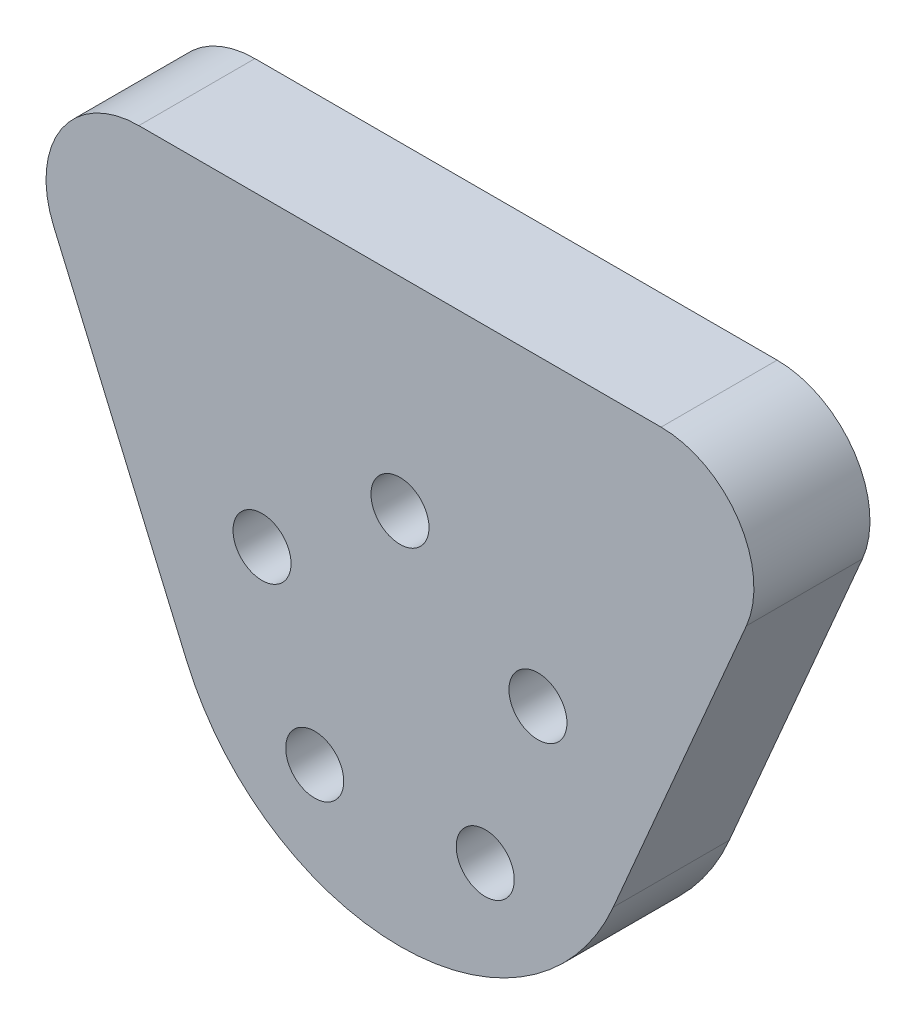
ISO-10303-21;
HEADER;
FILE_DESCRIPTION(('STEP AP214'),'2;1');
FILE_NAME('part.step','',(''),(''),'','','');
FILE_SCHEMA(('AUTOMOTIVE_DESIGN { 1 0 10303 214 1 1 1 1 }'));
ENDSEC;
DATA;
#1=APPLICATION_CONTEXT('core data for automotive mechanical design processes');
#2=APPLICATION_PROTOCOL_DEFINITION('international standard','automotive_design',2000,#1);
#3=PRODUCT_CONTEXT('',#1,'mechanical');
#4=PRODUCT('Part','Part','',(#3));
#5=PRODUCT_RELATED_PRODUCT_CATEGORY('part','',(#4));
#6=PRODUCT_DEFINITION_FORMATION('','',#4);
#7=PRODUCT_DEFINITION_CONTEXT('part definition',#1,'design');
#8=PRODUCT_DEFINITION('design','',#6,#7);
#9=PRODUCT_DEFINITION_SHAPE('','',#8);
#10=(LENGTH_UNIT() NAMED_UNIT(*) SI_UNIT(.MILLI.,.METRE.));
#11=(NAMED_UNIT(*) PLANE_ANGLE_UNIT() SI_UNIT($,.RADIAN.));
#12=(NAMED_UNIT(*) SI_UNIT($,.STERADIAN.) SOLID_ANGLE_UNIT());
#13=UNCERTAINTY_MEASURE_WITH_UNIT(LENGTH_MEASURE(1.E-05),#10,'distance_accuracy_value','');
#14=(GEOMETRIC_REPRESENTATION_CONTEXT(3) GLOBAL_UNCERTAINTY_ASSIGNED_CONTEXT((#13)) GLOBAL_UNIT_ASSIGNED_CONTEXT((#10,
#11,#12)) REPRESENTATION_CONTEXT('',''));
#15=CARTESIAN_POINT('',(0.,0.,0.));
#16=DIRECTION('',(0.,0.,1.));
#17=DIRECTION('',(1.,0.,0.));
#18=AXIS2_PLACEMENT_3D('',#15,#16,#17);
#19=CARTESIAN_POINT('',(-45.,0.,10.));
#20=DIRECTION('',(0.,0.,1.));
#21=DIRECTION('',(1.,0.,0.));
#22=AXIS2_PLACEMENT_3D('',#19,#20,#21);
#23=PLANE('',#22);
#24=CARTESIAN_POINT('',(-29.8473156536559,-32.1127124296868,10.));
#25=DIRECTION('',(0.,0.,1.));
#26=DIRECTION('',(1.,0.,0.));
#27=AXIS2_PLACEMENT_3D('',#24,#25,#26);
#28=CIRCLE('',#27,2.49999999999999);
#29=CARTESIAN_POINT('',(-27.3473156536559,-32.1127124296868,10.));
#30=VERTEX_POINT('',#29);
#31=EDGE_CURVE('E216',#30,#30,#28,.T.);
#32=ORIENTED_EDGE('',*,*,#31,.F.);
#33=EDGE_LOOP('',(#32));
#34=FACE_BOUND('',#33,.T.);
#35=CARTESIAN_POINT('',(-10.6117935463106,-18.1372875703131,10.));
#36=DIRECTION('',(0.,0.,1.));
#37=DIRECTION('',(1.,0.,0.));
#38=AXIS2_PLACEMENT_3D('',#35,#36,#37);
#39=CIRCLE('',#38,2.5);
#40=CARTESIAN_POINT('',(-8.11179354631056,-18.1372875703131,10.));
#41=VERTEX_POINT('',#40);
#42=EDGE_CURVE('E232',#41,#41,#39,.T.);
#43=ORIENTED_EDGE('',*,*,#42,.F.);
#44=EDGE_LOOP('',(#43));
#45=FACE_BOUND('',#44,.T.);
#46=CARTESIAN_POINT('',(-45.,0.,10.));
#47=DIRECTION('',(0.,0.,1.));
#48=DIRECTION('',(1.,0.,0.));
#49=AXIS2_PLACEMENT_3D('',#46,#47,#48);
#50=CIRCLE('',#49,8.);
#51=CARTESIAN_POINT('',(-45.,8.,10.));
#52=VERTEX_POINT('',#51);
#53=CARTESIAN_POINT('',(-52.3515841950434,-3.15502929038525,10.));
#54=VERTEX_POINT('',#53);
#55=EDGE_CURVE('E146',#52,#54,#50,.T.);
#56=ORIENTED_EDGE('',*,*,#55,.T.);
#57=DIRECTION('',(0.394378661298155,-0.918948024380419,0.));
#58=VECTOR('',#57,1.);
#59=CARTESIAN_POINT('',(-52.3515841950434,-3.15502929038525,10.));
#60=LINE('',#59,#58);
#61=CARTESIAN_POINT('',(-40.8789604876084,-29.8875732259631,10.));
#62=VERTEX_POINT('',#61);
#63=EDGE_CURVE('E94',#54,#62,#60,.T.);
#64=ORIENTED_EDGE('',*,*,#63,.T.);
#65=CARTESIAN_POINT('',(-22.5,-22.,10.));
#66=DIRECTION('',(0.,0.,1.));
#67=DIRECTION('',(1.,0.,0.));
#68=AXIS2_PLACEMENT_3D('',#65,#66,#67);
#69=CIRCLE('',#68,20.);
#70=CARTESIAN_POINT('',(-4.12103951239162,-29.8875732259631,10.));
#71=VERTEX_POINT('',#70);
#72=EDGE_CURVE('E107',#62,#71,#69,.T.);
#73=ORIENTED_EDGE('',*,*,#72,.T.);
#74=DIRECTION('',(0.394378661298155,0.918948024380419,0.));
#75=VECTOR('',#74,1.);
#76=CARTESIAN_POINT('',(7.35158419504335,-3.15502929038524,10.));
#77=LINE('',#76,#75);
#78=CARTESIAN_POINT('',(7.35158419504335,-3.15502929038525,10.));
#79=VERTEX_POINT('',#78);
#80=EDGE_CURVE('E101',#71,#79,#77,.T.);
#81=ORIENTED_EDGE('',*,*,#80,.T.);
#82=CARTESIAN_POINT('',(0.,0.,10.));
#83=DIRECTION('',(0.,0.,1.));
#84=DIRECTION('',(1.,0.,0.));
#85=AXIS2_PLACEMENT_3D('',#82,#83,#84);
#86=CIRCLE('',#85,8.);
#87=CARTESIAN_POINT('',(0.,8.,10.));
#88=VERTEX_POINT('',#87);
#89=EDGE_CURVE('E105',#79,#88,#86,.T.);
#90=ORIENTED_EDGE('',*,*,#89,.T.);
#91=DIRECTION('',(-1.,0.,0.));
#92=VECTOR('',#91,1.);
#93=CARTESIAN_POINT('',(-45.,8.,10.));
#94=LINE('',#93,#92);
#95=EDGE_CURVE('E57',#88,#52,#94,.T.);
#96=ORIENTED_EDGE('',*,*,#95,.T.);
#97=EDGE_LOOP('',(#56,#64,#73,#81,#90,#96));
#98=FACE_BOUND('',#97,.T.);
#99=CARTESIAN_POINT('',(-22.5,-9.49999999999999,10.));
#100=DIRECTION('',(0.,0.,1.));
#101=DIRECTION('',(1.,0.,0.));
#102=AXIS2_PLACEMENT_3D('',#99,#100,#101);
#103=CIRCLE('',#102,2.5);
#104=CARTESIAN_POINT('',(-20.,-9.49999999999999,10.));
#105=VERTEX_POINT('',#104);
#106=EDGE_CURVE('E134',#105,#105,#103,.T.);
#107=ORIENTED_EDGE('',*,*,#106,.F.);
#108=EDGE_LOOP('',(#107));
#109=FACE_BOUND('',#108,.T.);
#110=CARTESIAN_POINT('',(-15.1526843463441,-32.1127124296868,10.));
#111=DIRECTION('',(0.,0.,1.));
#112=DIRECTION('',(1.,0.,0.));
#113=AXIS2_PLACEMENT_3D('',#110,#111,#112);
#114=CIRCLE('',#113,2.5);
#115=CARTESIAN_POINT('',(-12.6526843463441,-32.1127124296868,10.));
#116=VERTEX_POINT('',#115);
#117=EDGE_CURVE('E224',#116,#116,#114,.T.);
#118=ORIENTED_EDGE('',*,*,#117,.F.);
#119=EDGE_LOOP('',(#118));
#120=FACE_BOUND('',#119,.T.);
#121=CARTESIAN_POINT('',(-34.3882064536894,-18.1372875703132,10.));
#122=DIRECTION('',(0.,0.,1.));
#123=DIRECTION('',(1.,0.,0.));
#124=AXIS2_PLACEMENT_3D('',#121,#122,#123);
#125=CIRCLE('',#124,2.49999999999999);
#126=CARTESIAN_POINT('',(-31.8882064536894,-18.1372875703132,10.));
#127=VERTEX_POINT('',#126);
#128=EDGE_CURVE('E205',#127,#127,#125,.T.);
#129=ORIENTED_EDGE('',*,*,#128,.F.);
#130=EDGE_LOOP('',(#129));
#131=FACE_BOUND('',#130,.T.);
#132=ADVANCED_FACE('F39',(#34,#45,#98,#109,#120,#131),#23,.T.);
#133=CARTESIAN_POINT('',(-45.,0.,0.));
#134=DIRECTION('',(0.,0.,1.));
#135=DIRECTION('',(1.,0.,0.));
#136=AXIS2_PLACEMENT_3D('',#133,#134,#135);
#137=PLANE('',#136);
#138=CARTESIAN_POINT('',(-45.,0.,0.));
#139=DIRECTION('',(0.,0.,1.));
#140=DIRECTION('',(1.,0.,0.));
#141=AXIS2_PLACEMENT_3D('',#138,#139,#140);
#142=CIRCLE('',#141,8.);
#143=CARTESIAN_POINT('',(-45.,8.,0.));
#144=VERTEX_POINT('',#143);
#145=CARTESIAN_POINT('',(-52.3515841950434,-3.15502929038525,0.));
#146=VERTEX_POINT('',#145);
#147=EDGE_CURVE('E129',#144,#146,#142,.T.);
#148=ORIENTED_EDGE('',*,*,#147,.F.);
#149=DIRECTION('',(-1.,0.,0.));
#150=VECTOR('',#149,1.);
#151=CARTESIAN_POINT('',(-45.,8.,0.));
#152=LINE('',#151,#150);
#153=CARTESIAN_POINT('',(0.,8.,0.));
#154=VERTEX_POINT('',#153);
#155=EDGE_CURVE('E86',#154,#144,#152,.T.);
#156=ORIENTED_EDGE('',*,*,#155,.F.);
#157=CARTESIAN_POINT('',(0.,0.,0.));
#158=DIRECTION('',(0.,0.,1.));
#159=DIRECTION('',(1.,0.,0.));
#160=AXIS2_PLACEMENT_3D('',#157,#158,#159);
#161=CIRCLE('',#160,8.);
#162=CARTESIAN_POINT('',(7.35158419504335,-3.15502929038525,0.));
#163=VERTEX_POINT('',#162);
#164=EDGE_CURVE('E80',#163,#154,#161,.T.);
#165=ORIENTED_EDGE('',*,*,#164,.F.);
#166=DIRECTION('',(0.394378661298155,0.918948024380419,0.));
#167=VECTOR('',#166,1.);
#168=CARTESIAN_POINT('',(7.35158419504335,-3.15502929038524,0.));
#169=LINE('',#168,#167);
#170=CARTESIAN_POINT('',(-4.12103951239162,-29.8875732259631,0.));
#171=VERTEX_POINT('',#170);
#172=EDGE_CURVE('E116',#171,#163,#169,.T.);
#173=ORIENTED_EDGE('',*,*,#172,.F.);
#174=CARTESIAN_POINT('',(-22.5,-22.,0.));
#175=DIRECTION('',(0.,0.,1.));
#176=DIRECTION('',(1.,0.,0.));
#177=AXIS2_PLACEMENT_3D('',#174,#175,#176);
#178=CIRCLE('',#177,20.);
#179=CARTESIAN_POINT('',(-40.8789604876084,-29.8875732259631,0.));
#180=VERTEX_POINT('',#179);
#181=EDGE_CURVE('E137',#180,#171,#178,.T.);
#182=ORIENTED_EDGE('',*,*,#181,.F.);
#183=DIRECTION('',(0.394378661298155,-0.918948024380419,0.));
#184=VECTOR('',#183,1.);
#185=CARTESIAN_POINT('',(-52.3515841950434,-3.15502929038525,0.));
#186=LINE('',#185,#184);
#187=EDGE_CURVE('E133',#146,#180,#186,.T.);
#188=ORIENTED_EDGE('',*,*,#187,.F.);
#189=EDGE_LOOP('',(#148,#156,#165,#173,#182,#188));
#190=FACE_BOUND('',#189,.T.);
#191=CARTESIAN_POINT('',(-22.5,-9.49999999999999,0.));
#192=DIRECTION('',(0.,0.,1.));
#193=DIRECTION('',(1.,0.,0.));
#194=AXIS2_PLACEMENT_3D('',#191,#192,#193);
#195=CIRCLE('',#194,2.5);
#196=CARTESIAN_POINT('',(-20.,-9.49999999999999,0.));
#197=VERTEX_POINT('',#196);
#198=EDGE_CURVE('E236',#197,#197,#195,.T.);
#199=ORIENTED_EDGE('',*,*,#198,.T.);
#200=EDGE_LOOP('',(#199));
#201=FACE_BOUND('',#200,.T.);
#202=CARTESIAN_POINT('',(-10.6117935463106,-18.1372875703131,0.));
#203=DIRECTION('',(0.,0.,1.));
#204=DIRECTION('',(1.,0.,0.));
#205=AXIS2_PLACEMENT_3D('',#202,#203,#204);
#206=CIRCLE('',#205,2.5);
#207=CARTESIAN_POINT('',(-8.11179354631056,-18.1372875703131,0.));
#208=VERTEX_POINT('',#207);
#209=EDGE_CURVE('E228',#208,#208,#206,.T.);
#210=ORIENTED_EDGE('',*,*,#209,.T.);
#211=EDGE_LOOP('',(#210));
#212=FACE_BOUND('',#211,.T.);
#213=CARTESIAN_POINT('',(-15.1526843463441,-32.1127124296868,0.));
#214=DIRECTION('',(0.,0.,1.));
#215=DIRECTION('',(1.,0.,0.));
#216=AXIS2_PLACEMENT_3D('',#213,#214,#215);
#217=CIRCLE('',#216,2.5);
#218=CARTESIAN_POINT('',(-12.6526843463441,-32.1127124296868,0.));
#219=VERTEX_POINT('',#218);
#220=EDGE_CURVE('E220',#219,#219,#217,.T.);
#221=ORIENTED_EDGE('',*,*,#220,.T.);
#222=EDGE_LOOP('',(#221));
#223=FACE_BOUND('',#222,.T.);
#224=CARTESIAN_POINT('',(-29.8473156536559,-32.1127124296868,0.));
#225=DIRECTION('',(0.,0.,1.));
#226=DIRECTION('',(1.,0.,0.));
#227=AXIS2_PLACEMENT_3D('',#224,#225,#226);
#228=CIRCLE('',#227,2.49999999999999);
#229=CARTESIAN_POINT('',(-27.3473156536559,-32.1127124296868,0.));
#230=VERTEX_POINT('',#229);
#231=EDGE_CURVE('E213',#230,#230,#228,.T.);
#232=ORIENTED_EDGE('',*,*,#231,.T.);
#233=EDGE_LOOP('',(#232));
#234=FACE_BOUND('',#233,.T.);
#235=CARTESIAN_POINT('',(-34.3882064536894,-18.1372875703132,0.));
#236=DIRECTION('',(0.,0.,1.));
#237=DIRECTION('',(1.,0.,0.));
#238=AXIS2_PLACEMENT_3D('',#235,#236,#237);
#239=CIRCLE('',#238,2.49999999999999);
#240=CARTESIAN_POINT('',(-31.8882064536894,-18.1372875703132,0.));
#241=VERTEX_POINT('',#240);
#242=EDGE_CURVE('E208',#241,#241,#239,.T.);
#243=ORIENTED_EDGE('',*,*,#242,.T.);
#244=EDGE_LOOP('',(#243));
#245=FACE_BOUND('',#244,.T.);
#246=ADVANCED_FACE('F159',(#190,#201,#212,#223,#234,#245),#137,.F.);
#247=CARTESIAN_POINT('',(-45.,0.,10.));
#248=DIRECTION('',(0.,0.,-1.));
#249=DIRECTION('',(-1.,0.,0.));
#250=AXIS2_PLACEMENT_3D('',#247,#248,#249);
#251=CYLINDRICAL_SURFACE('',#250,8.);
#252=ORIENTED_EDGE('',*,*,#147,.T.);
#253=DIRECTION('',(0.,0.,-1.));
#254=VECTOR('',#253,1.);
#255=CARTESIAN_POINT('',(-52.3515841950434,-3.15502929038525,10.));
#256=LINE('',#255,#254);
#257=EDGE_CURVE('E11',#54,#146,#256,.T.);
#258=ORIENTED_EDGE('',*,*,#257,.F.);
#259=ORIENTED_EDGE('',*,*,#55,.F.);
#260=DIRECTION('',(0.,0.,-1.));
#261=VECTOR('',#260,1.);
#262=CARTESIAN_POINT('',(-45.,8.,10.));
#263=LINE('',#262,#261);
#264=EDGE_CURVE('E125',#52,#144,#263,.T.);
#265=ORIENTED_EDGE('',*,*,#264,.T.);
#266=EDGE_LOOP('',(#252,#258,#259,#265));
#267=FACE_BOUND('',#266,.T.);
#268=ADVANCED_FACE('F41',(#267),#251,.T.);
#269=CARTESIAN_POINT('',(-52.3515841950434,-3.15502929038525,10.));
#270=DIRECTION('',(0.918948024380419,0.394378661298155,0.));
#271=DIRECTION('',(-0.394378661298156,0.918948024380419,0.));
#272=AXIS2_PLACEMENT_3D('',#269,#270,#271);
#273=PLANE('',#272);
#274=ORIENTED_EDGE('',*,*,#187,.T.);
#275=DIRECTION('',(0.,0.,-1.));
#276=VECTOR('',#275,1.);
#277=CARTESIAN_POINT('',(-40.8789604876084,-29.8875732259631,10.));
#278=LINE('',#277,#276);
#279=EDGE_CURVE('E49',#62,#180,#278,.T.);
#280=ORIENTED_EDGE('',*,*,#279,.F.);
#281=ORIENTED_EDGE('',*,*,#63,.F.);
#282=ORIENTED_EDGE('',*,*,#257,.T.);
#283=EDGE_LOOP('',(#274,#280,#281,#282));
#284=FACE_BOUND('',#283,.T.);
#285=ADVANCED_FACE('F309',(#284),#273,.F.);
#286=CARTESIAN_POINT('',(-22.5,-22.,10.));
#287=DIRECTION('',(0.,0.,-1.));
#288=DIRECTION('',(-1.,0.,0.));
#289=AXIS2_PLACEMENT_3D('',#286,#287,#288);
#290=CYLINDRICAL_SURFACE('',#289,20.);
#291=ORIENTED_EDGE('',*,*,#181,.T.);
#292=DIRECTION('',(0.,0.,-1.));
#293=VECTOR('',#292,1.);
#294=CARTESIAN_POINT('',(-4.12103951239162,-29.8875732259631,10.));
#295=LINE('',#294,#293);
#296=EDGE_CURVE('E118',#71,#171,#295,.T.);
#297=ORIENTED_EDGE('',*,*,#296,.F.);
#298=ORIENTED_EDGE('',*,*,#72,.F.);
#299=ORIENTED_EDGE('',*,*,#279,.T.);
#300=EDGE_LOOP('',(#291,#297,#298,#299));
#301=FACE_BOUND('',#300,.T.);
#302=ADVANCED_FACE('F156',(#301),#290,.T.);
#303=CARTESIAN_POINT('',(7.35158419504335,-3.15502929038524,10.));
#304=DIRECTION('',(-0.918948024380419,0.394378661298155,0.));
#305=DIRECTION('',(-0.394378661298156,-0.918948024380419,0.));
#306=AXIS2_PLACEMENT_3D('',#303,#304,#305);
#307=PLANE('',#306);
#308=ORIENTED_EDGE('',*,*,#172,.T.);
#309=DIRECTION('',(0.,0.,-1.));
#310=VECTOR('',#309,1.);
#311=CARTESIAN_POINT('',(7.35158419504335,-3.15502929038525,10.));
#312=LINE('',#311,#310);
#313=EDGE_CURVE('E113',#79,#163,#312,.T.);
#314=ORIENTED_EDGE('',*,*,#313,.F.);
#315=ORIENTED_EDGE('',*,*,#80,.F.);
#316=ORIENTED_EDGE('',*,*,#296,.T.);
#317=EDGE_LOOP('',(#308,#314,#315,#316));
#318=FACE_BOUND('',#317,.T.);
#319=ADVANCED_FACE('F114',(#318),#307,.F.);
#320=CARTESIAN_POINT('',(0.,0.,10.));
#321=DIRECTION('',(0.,0.,-1.));
#322=DIRECTION('',(-1.,0.,0.));
#323=AXIS2_PLACEMENT_3D('',#320,#321,#322);
#324=CYLINDRICAL_SURFACE('',#323,8.);
#325=ORIENTED_EDGE('',*,*,#164,.T.);
#326=DIRECTION('',(0.,0.,-1.));
#327=VECTOR('',#326,1.);
#328=CARTESIAN_POINT('',(0.,8.,10.));
#329=LINE('',#328,#327);
#330=EDGE_CURVE('E119',#88,#154,#329,.T.);
#331=ORIENTED_EDGE('',*,*,#330,.F.);
#332=ORIENTED_EDGE('',*,*,#89,.F.);
#333=ORIENTED_EDGE('',*,*,#313,.T.);
#334=EDGE_LOOP('',(#325,#331,#332,#333));
#335=FACE_BOUND('',#334,.T.);
#336=ADVANCED_FACE('F121',(#335),#324,.T.);
#337=CARTESIAN_POINT('',(-45.,8.,10.));
#338=DIRECTION('',(0.,-1.,0.));
#339=DIRECTION('',(0.,0.,-1.));
#340=AXIS2_PLACEMENT_3D('',#337,#338,#339);
#341=PLANE('',#340);
#342=ORIENTED_EDGE('',*,*,#155,.T.);
#343=ORIENTED_EDGE('',*,*,#264,.F.);
#344=ORIENTED_EDGE('',*,*,#95,.F.);
#345=ORIENTED_EDGE('',*,*,#330,.T.);
#346=EDGE_LOOP('',(#342,#343,#344,#345));
#347=FACE_BOUND('',#346,.T.);
#348=ADVANCED_FACE('F164',(#347),#341,.F.);
#349=CARTESIAN_POINT('',(-22.5,-9.49999999999999,10.));
#350=DIRECTION('',(0.,0.,-1.));
#351=DIRECTION('',(-1.,0.,0.));
#352=AXIS2_PLACEMENT_3D('',#349,#350,#351);
#353=CYLINDRICAL_SURFACE('',#352,2.5);
#354=ORIENTED_EDGE('',*,*,#106,.T.);
#355=EDGE_LOOP('',(#354));
#356=FACE_BOUND('',#355,.T.);
#357=ORIENTED_EDGE('',*,*,#198,.F.);
#358=EDGE_LOOP('',(#357));
#359=FACE_BOUND('',#358,.T.);
#360=ADVANCED_FACE('F166',(#356,#359),#353,.F.);
#361=CARTESIAN_POINT('',(-10.6117935463106,-18.1372875703131,10.));
#362=DIRECTION('',(0.,0.,-1.));
#363=DIRECTION('',(-1.,0.,0.));
#364=AXIS2_PLACEMENT_3D('',#361,#362,#363);
#365=CYLINDRICAL_SURFACE('',#364,2.5);
#366=ORIENTED_EDGE('',*,*,#42,.T.);
#367=EDGE_LOOP('',(#366));
#368=FACE_BOUND('',#367,.T.);
#369=ORIENTED_EDGE('',*,*,#209,.F.);
#370=EDGE_LOOP('',(#369));
#371=FACE_BOUND('',#370,.T.);
#372=ADVANCED_FACE('F172',(#368,#371),#365,.F.);
#373=CARTESIAN_POINT('',(-15.1526843463441,-32.1127124296868,10.));
#374=DIRECTION('',(0.,0.,-1.));
#375=DIRECTION('',(-1.,0.,0.));
#376=AXIS2_PLACEMENT_3D('',#373,#374,#375);
#377=CYLINDRICAL_SURFACE('',#376,2.5);
#378=ORIENTED_EDGE('',*,*,#117,.T.);
#379=EDGE_LOOP('',(#378));
#380=FACE_BOUND('',#379,.T.);
#381=ORIENTED_EDGE('',*,*,#220,.F.);
#382=EDGE_LOOP('',(#381));
#383=FACE_BOUND('',#382,.T.);
#384=ADVANCED_FACE('F188',(#380,#383),#377,.F.);
#385=CARTESIAN_POINT('',(-29.8473156536559,-32.1127124296868,10.));
#386=DIRECTION('',(0.,0.,-1.));
#387=DIRECTION('',(-1.,0.,0.));
#388=AXIS2_PLACEMENT_3D('',#385,#386,#387);
#389=CYLINDRICAL_SURFACE('',#388,2.49999999999999);
#390=ORIENTED_EDGE('',*,*,#31,.T.);
#391=EDGE_LOOP('',(#390));
#392=FACE_BOUND('',#391,.T.);
#393=ORIENTED_EDGE('',*,*,#231,.F.);
#394=EDGE_LOOP('',(#393));
#395=FACE_BOUND('',#394,.T.);
#396=ADVANCED_FACE('F192',(#392,#395),#389,.F.);
#397=CARTESIAN_POINT('',(-34.3882064536894,-18.1372875703132,10.));
#398=DIRECTION('',(0.,0.,-1.));
#399=DIRECTION('',(-1.,0.,0.));
#400=AXIS2_PLACEMENT_3D('',#397,#398,#399);
#401=CYLINDRICAL_SURFACE('',#400,2.49999999999999);
#402=ORIENTED_EDGE('',*,*,#128,.T.);
#403=EDGE_LOOP('',(#402));
#404=FACE_BOUND('',#403,.T.);
#405=ORIENTED_EDGE('',*,*,#242,.F.);
#406=EDGE_LOOP('',(#405));
#407=FACE_BOUND('',#406,.T.);
#408=ADVANCED_FACE('F196',(#404,#407),#401,.F.);
#409=CLOSED_SHELL('',(#132,#246,#268,#285,#302,#319,#336,#348,#360,#372,#384,#396,#408));
#410=MANIFOLD_SOLID_BREP('B2',#409);
#411=ADVANCED_BREP_SHAPE_REPRESENTATION('',(#18,#410),#14);
#412=SHAPE_DEFINITION_REPRESENTATION(#9,#411);
ENDSEC;
END-ISO-10303-21;
